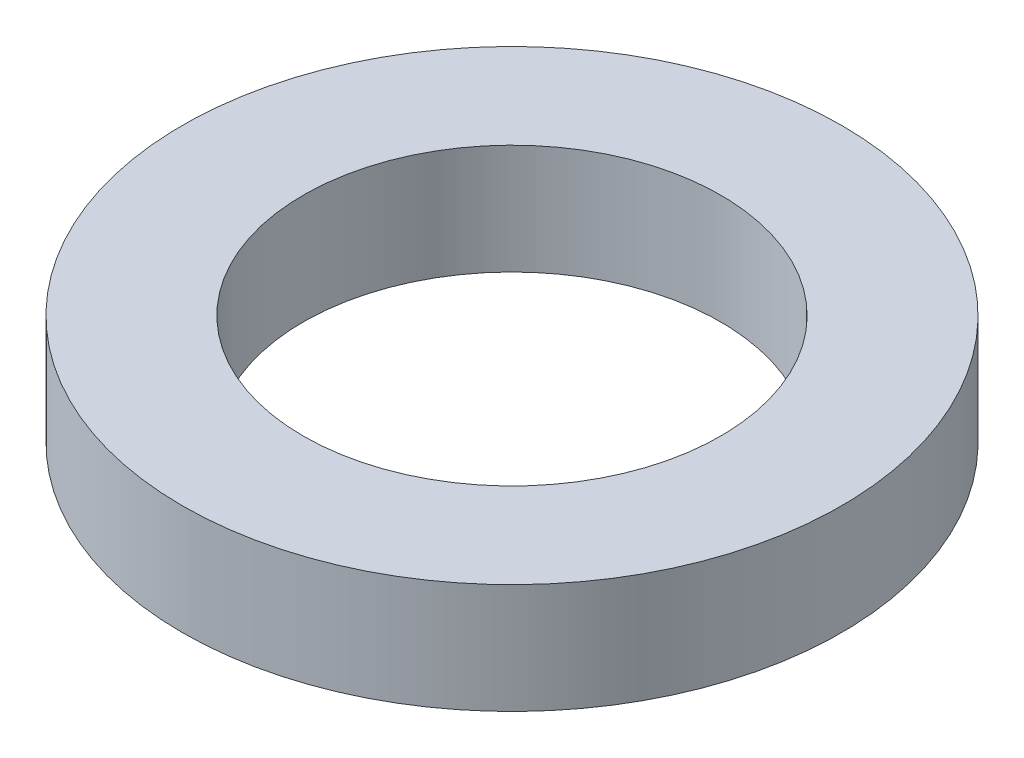
ISO-10303-21;
HEADER;
FILE_DESCRIPTION(('STEP AP214'),'2;1');
FILE_NAME('part.step','',(''),(''),'','','');
FILE_SCHEMA(('AUTOMOTIVE_DESIGN { 1 0 10303 214 1 1 1 1 }'));
ENDSEC;
DATA;
#1=APPLICATION_CONTEXT('core data for automotive mechanical design processes');
#2=APPLICATION_PROTOCOL_DEFINITION('international standard','automotive_design',2000,#1);
#3=PRODUCT_CONTEXT('',#1,'mechanical');
#4=PRODUCT('Part','Part','',(#3));
#5=PRODUCT_RELATED_PRODUCT_CATEGORY('part','',(#4));
#6=PRODUCT_DEFINITION_FORMATION('','',#4);
#7=PRODUCT_DEFINITION_CONTEXT('part definition',#1,'design');
#8=PRODUCT_DEFINITION('design','',#6,#7);
#9=PRODUCT_DEFINITION_SHAPE('','',#8);
#10=(LENGTH_UNIT() NAMED_UNIT(*) SI_UNIT(.MILLI.,.METRE.));
#11=(NAMED_UNIT(*) PLANE_ANGLE_UNIT() SI_UNIT($,.RADIAN.));
#12=(NAMED_UNIT(*) SI_UNIT($,.STERADIAN.) SOLID_ANGLE_UNIT());
#13=UNCERTAINTY_MEASURE_WITH_UNIT(LENGTH_MEASURE(1.E-05),#10,'distance_accuracy_value','');
#14=(GEOMETRIC_REPRESENTATION_CONTEXT(3) GLOBAL_UNCERTAINTY_ASSIGNED_CONTEXT((#13)) GLOBAL_UNIT_ASSIGNED_CONTEXT((#10,
#11,#12)) REPRESENTATION_CONTEXT('',''));
#15=CARTESIAN_POINT('',(0.,0.,0.));
#16=DIRECTION('',(0.,0.,1.));
#17=DIRECTION('',(1.,0.,0.));
#18=AXIS2_PLACEMENT_3D('',#15,#16,#17);
#19=CARTESIAN_POINT('',(0.,1.,0.));
#20=DIRECTION('',(0.,1.,0.));
#21=DIRECTION('',(0.,0.,1.));
#22=AXIS2_PLACEMENT_3D('',#19,#20,#21);
#23=PLANE('',#22);
#24=CARTESIAN_POINT('',(0.,1.,0.));
#25=DIRECTION('',(0.,1.,0.));
#26=DIRECTION('',(0.,0.,1.));
#27=AXIS2_PLACEMENT_3D('',#24,#25,#26);
#28=CIRCLE('',#27,3.);
#29=CARTESIAN_POINT('',(0.,1.,3.));
#30=VERTEX_POINT('',#29);
#31=EDGE_CURVE('E10',#30,#30,#28,.T.);
#32=ORIENTED_EDGE('',*,*,#31,.T.);
#33=EDGE_LOOP('',(#32));
#34=FACE_BOUND('',#33,.T.);
#35=CARTESIAN_POINT('',(0.,1.,0.));
#36=DIRECTION('',(0.,1.,0.));
#37=DIRECTION('',(0.,0.,1.));
#38=AXIS2_PLACEMENT_3D('',#35,#36,#37);
#39=CIRCLE('',#38,1.9);
#40=CARTESIAN_POINT('',(0.,1.,1.9));
#41=VERTEX_POINT('',#40);
#42=EDGE_CURVE('E53',#41,#41,#39,.T.);
#43=ORIENTED_EDGE('',*,*,#42,.F.);
#44=EDGE_LOOP('',(#43));
#45=FACE_BOUND('',#44,.T.);
#46=ADVANCED_FACE('F40',(#34,#45),#23,.T.);
#47=CARTESIAN_POINT('',(0.,0.,0.));
#48=DIRECTION('',(0.,1.,0.));
#49=DIRECTION('',(0.,0.,1.));
#50=AXIS2_PLACEMENT_3D('',#47,#48,#49);
#51=PLANE('',#50);
#52=CARTESIAN_POINT('',(0.,0.,0.));
#53=DIRECTION('',(0.,1.,0.));
#54=DIRECTION('',(0.,0.,1.));
#55=AXIS2_PLACEMENT_3D('',#52,#53,#54);
#56=CIRCLE('',#55,3.);
#57=CARTESIAN_POINT('',(0.,0.,3.));
#58=VERTEX_POINT('',#57);
#59=EDGE_CURVE('E44',#58,#58,#56,.T.);
#60=ORIENTED_EDGE('',*,*,#59,.F.);
#61=EDGE_LOOP('',(#60));
#62=FACE_BOUND('',#61,.T.);
#63=CARTESIAN_POINT('',(0.,0.,0.));
#64=DIRECTION('',(0.,1.,0.));
#65=DIRECTION('',(0.,0.,1.));
#66=AXIS2_PLACEMENT_3D('',#63,#64,#65);
#67=CIRCLE('',#66,1.9);
#68=CARTESIAN_POINT('',(0.,0.,1.9));
#69=VERTEX_POINT('',#68);
#70=EDGE_CURVE('E55',#69,#69,#67,.T.);
#71=ORIENTED_EDGE('',*,*,#70,.T.);
#72=EDGE_LOOP('',(#71));
#73=FACE_BOUND('',#72,.T.);
#74=ADVANCED_FACE('F67',(#62,#73),#51,.F.);
#75=CARTESIAN_POINT('',(0.,1.,0.));
#76=DIRECTION('',(0.,-1.,0.));
#77=DIRECTION('',(0.,0.,-1.));
#78=AXIS2_PLACEMENT_3D('',#75,#76,#77);
#79=CYLINDRICAL_SURFACE('',#78,3.);
#80=ORIENTED_EDGE('',*,*,#31,.F.);
#81=EDGE_LOOP('',(#80));
#82=FACE_BOUND('',#81,.T.);
#83=ORIENTED_EDGE('',*,*,#59,.T.);
#84=EDGE_LOOP('',(#83));
#85=FACE_BOUND('',#84,.T.);
#86=ADVANCED_FACE('F42',(#82,#85),#79,.T.);
#87=CARTESIAN_POINT('',(0.,1.,0.));
#88=DIRECTION('',(0.,-1.,0.));
#89=DIRECTION('',(0.,0.,-1.));
#90=AXIS2_PLACEMENT_3D('',#87,#88,#89);
#91=CYLINDRICAL_SURFACE('',#90,1.9);
#92=ORIENTED_EDGE('',*,*,#42,.T.);
#93=EDGE_LOOP('',(#92));
#94=FACE_BOUND('',#93,.T.);
#95=ORIENTED_EDGE('',*,*,#70,.F.);
#96=EDGE_LOOP('',(#95));
#97=FACE_BOUND('',#96,.T.);
#98=ADVANCED_FACE('F63',(#94,#97),#91,.F.);
#99=CLOSED_SHELL('',(#46,#74,#86,#98));
#100=MANIFOLD_SOLID_BREP('B2',#99);
#101=ADVANCED_BREP_SHAPE_REPRESENTATION('',(#18,#100),#14);
#102=SHAPE_DEFINITION_REPRESENTATION(#9,#101);
ENDSEC;
END-ISO-10303-21;
